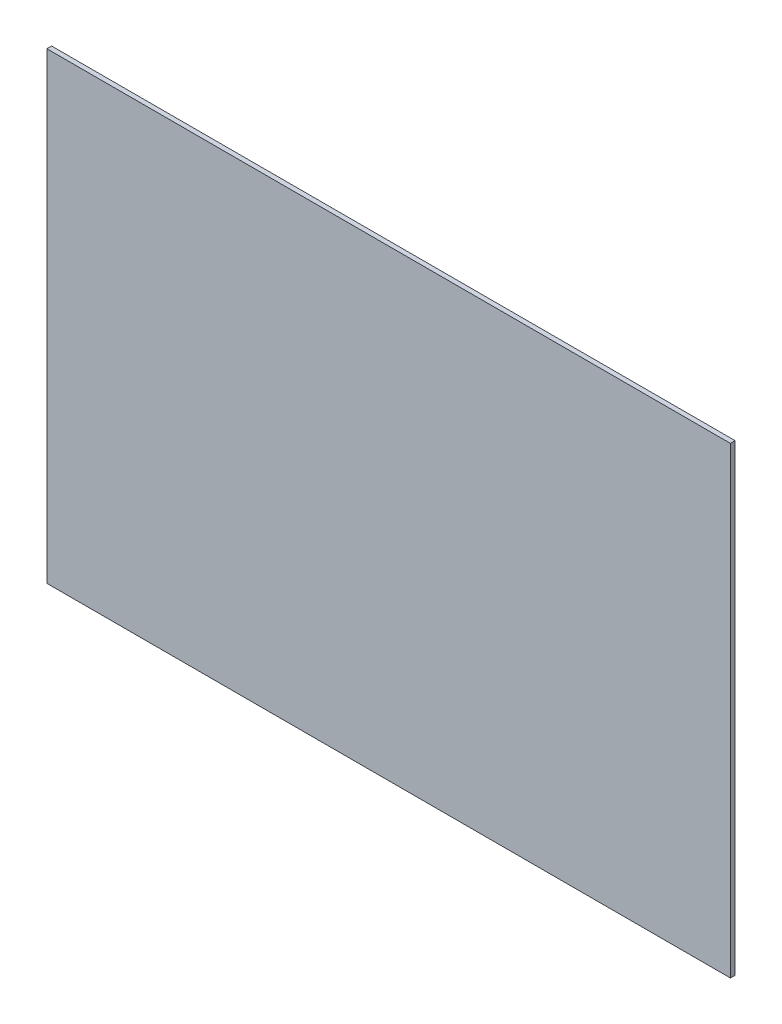
ISO-10303-21;
HEADER;
FILE_DESCRIPTION(('STEP AP214'),'2;1');
FILE_NAME('part.step','',(''),(''),'','','');
FILE_SCHEMA(('AUTOMOTIVE_DESIGN { 1 0 10303 214 1 1 1 1 }'));
ENDSEC;
DATA;
#1=APPLICATION_CONTEXT('core data for automotive mechanical design processes');
#2=APPLICATION_PROTOCOL_DEFINITION('international standard','automotive_design',2000,#1);
#3=PRODUCT_CONTEXT('',#1,'mechanical');
#4=PRODUCT('Part','Part','',(#3));
#5=PRODUCT_RELATED_PRODUCT_CATEGORY('part','',(#4));
#6=PRODUCT_DEFINITION_FORMATION('','',#4);
#7=PRODUCT_DEFINITION_CONTEXT('part definition',#1,'design');
#8=PRODUCT_DEFINITION('design','',#6,#7);
#9=PRODUCT_DEFINITION_SHAPE('','',#8);
#10=(LENGTH_UNIT() NAMED_UNIT(*) SI_UNIT(.MILLI.,.METRE.));
#11=(NAMED_UNIT(*) PLANE_ANGLE_UNIT() SI_UNIT($,.RADIAN.));
#12=(NAMED_UNIT(*) SI_UNIT($,.STERADIAN.) SOLID_ANGLE_UNIT());
#13=UNCERTAINTY_MEASURE_WITH_UNIT(LENGTH_MEASURE(1.E-05),#10,'distance_accuracy_value','');
#14=(GEOMETRIC_REPRESENTATION_CONTEXT(3) GLOBAL_UNCERTAINTY_ASSIGNED_CONTEXT((#13)) GLOBAL_UNIT_ASSIGNED_CONTEXT((#10,
#11,#12)) REPRESENTATION_CONTEXT('',''));
#15=CARTESIAN_POINT('',(0.,0.,0.));
#16=DIRECTION('',(0.,0.,1.));
#17=DIRECTION('',(1.,0.,0.));
#18=AXIS2_PLACEMENT_3D('',#15,#16,#17);
#19=CARTESIAN_POINT('',(229.745,155.63,3.175));
#20=DIRECTION('',(-1.,0.,0.));
#21=DIRECTION('',(0.,-1.,0.));
#22=AXIS2_PLACEMENT_3D('',#19,#20,#21);
#23=PLANE('',#22);
#24=DIRECTION('',(0.,1.,0.));
#25=VECTOR('',#24,1.);
#26=CARTESIAN_POINT('',(229.745,155.63,0.));
#27=LINE('',#26,#25);
#28=CARTESIAN_POINT('',(229.745,-155.63,0.));
#29=VERTEX_POINT('',#28);
#30=CARTESIAN_POINT('',(229.745,155.63,0.));
#31=VERTEX_POINT('',#30);
#32=EDGE_CURVE('E104',#29,#31,#27,.T.);
#33=ORIENTED_EDGE('',*,*,#32,.T.);
#34=DIRECTION('',(0.,0.,-1.));
#35=VECTOR('',#34,1.);
#36=CARTESIAN_POINT('',(229.745,155.63,3.175));
#37=LINE('',#36,#35);
#38=CARTESIAN_POINT('',(229.745,155.63,3.175));
#39=VERTEX_POINT('',#38);
#40=EDGE_CURVE('E11',#39,#31,#37,.T.);
#41=ORIENTED_EDGE('',*,*,#40,.F.);
#42=DIRECTION('',(0.,1.,0.));
#43=VECTOR('',#42,1.);
#44=CARTESIAN_POINT('',(229.745,155.63,3.175));
#45=LINE('',#44,#43);
#46=CARTESIAN_POINT('',(229.745,-155.63,3.175));
#47=VERTEX_POINT('',#46);
#48=EDGE_CURVE('E92',#47,#39,#45,.T.);
#49=ORIENTED_EDGE('',*,*,#48,.F.);
#50=DIRECTION('',(0.,0.,-1.));
#51=VECTOR('',#50,1.);
#52=CARTESIAN_POINT('',(229.745,-155.63,3.175));
#53=LINE('',#52,#51);
#54=EDGE_CURVE('E100',#47,#29,#53,.T.);
#55=ORIENTED_EDGE('',*,*,#54,.T.);
#56=EDGE_LOOP('',(#33,#41,#49,#55));
#57=FACE_BOUND('',#56,.T.);
#58=ADVANCED_FACE('F41',(#57),#23,.F.);
#59=CARTESIAN_POINT('',(-229.745,155.63,3.175));
#60=DIRECTION('',(0.,-1.,0.));
#61=DIRECTION('',(0.,0.,-1.));
#62=AXIS2_PLACEMENT_3D('',#59,#60,#61);
#63=PLANE('',#62);
#64=DIRECTION('',(-1.,0.,0.));
#65=VECTOR('',#64,1.);
#66=CARTESIAN_POINT('',(-229.745,155.63,0.));
#67=LINE('',#66,#65);
#68=CARTESIAN_POINT('',(-229.745,155.63,0.));
#69=VERTEX_POINT('',#68);
#70=EDGE_CURVE('E96',#31,#69,#67,.T.);
#71=ORIENTED_EDGE('',*,*,#70,.T.);
#72=DIRECTION('',(0.,0.,-1.));
#73=VECTOR('',#72,1.);
#74=CARTESIAN_POINT('',(-229.745,155.63,3.175));
#75=LINE('',#74,#73);
#76=CARTESIAN_POINT('',(-229.745,155.63,3.175));
#77=VERTEX_POINT('',#76);
#78=EDGE_CURVE('E49',#77,#69,#75,.T.);
#79=ORIENTED_EDGE('',*,*,#78,.F.);
#80=DIRECTION('',(-1.,0.,0.));
#81=VECTOR('',#80,1.);
#82=CARTESIAN_POINT('',(-229.745,155.63,3.175));
#83=LINE('',#82,#81);
#84=EDGE_CURVE('E87',#39,#77,#83,.T.);
#85=ORIENTED_EDGE('',*,*,#84,.F.);
#86=ORIENTED_EDGE('',*,*,#40,.T.);
#87=EDGE_LOOP('',(#71,#79,#85,#86));
#88=FACE_BOUND('',#87,.T.);
#89=ADVANCED_FACE('F95',(#88),#63,.F.);
#90=CARTESIAN_POINT('',(-229.745,155.63,3.175));
#91=DIRECTION('',(1.,0.,0.));
#92=DIRECTION('',(0.,1.,0.));
#93=AXIS2_PLACEMENT_3D('',#90,#91,#92);
#94=PLANE('',#93);
#95=DIRECTION('',(0.,-1.,0.));
#96=VECTOR('',#95,1.);
#97=CARTESIAN_POINT('',(-229.745,155.63,0.));
#98=LINE('',#97,#96);
#99=CARTESIAN_POINT('',(-229.745,-155.63,0.));
#100=VERTEX_POINT('',#99);
#101=EDGE_CURVE('E74',#69,#100,#98,.T.);
#102=ORIENTED_EDGE('',*,*,#101,.T.);
#103=DIRECTION('',(0.,0.,-1.));
#104=VECTOR('',#103,1.);
#105=CARTESIAN_POINT('',(-229.745,-155.63,3.175));
#106=LINE('',#105,#104);
#107=CARTESIAN_POINT('',(-229.745,-155.63,3.175));
#108=VERTEX_POINT('',#107);
#109=EDGE_CURVE('E97',#108,#100,#106,.T.);
#110=ORIENTED_EDGE('',*,*,#109,.F.);
#111=DIRECTION('',(0.,-1.,0.));
#112=VECTOR('',#111,1.);
#113=CARTESIAN_POINT('',(-229.745,155.63,3.175));
#114=LINE('',#113,#112);
#115=EDGE_CURVE('E90',#77,#108,#114,.T.);
#116=ORIENTED_EDGE('',*,*,#115,.F.);
#117=ORIENTED_EDGE('',*,*,#78,.T.);
#118=EDGE_LOOP('',(#102,#110,#116,#117));
#119=FACE_BOUND('',#118,.T.);
#120=ADVANCED_FACE('F98',(#119),#94,.F.);
#121=CARTESIAN_POINT('',(-229.745,-155.63,3.175));
#122=DIRECTION('',(0.,1.,0.));
#123=DIRECTION('',(0.,0.,1.));
#124=AXIS2_PLACEMENT_3D('',#121,#122,#123);
#125=PLANE('',#124);
#126=DIRECTION('',(1.,0.,0.));
#127=VECTOR('',#126,1.);
#128=CARTESIAN_POINT('',(-229.745,-155.63,0.));
#129=LINE('',#128,#127);
#130=EDGE_CURVE('E80',#100,#29,#129,.T.);
#131=ORIENTED_EDGE('',*,*,#130,.T.);
#132=ORIENTED_EDGE('',*,*,#54,.F.);
#133=DIRECTION('',(1.,0.,0.));
#134=VECTOR('',#133,1.);
#135=CARTESIAN_POINT('',(-229.745,-155.63,3.175));
#136=LINE('',#135,#134);
#137=EDGE_CURVE('E57',#108,#47,#136,.T.);
#138=ORIENTED_EDGE('',*,*,#137,.F.);
#139=ORIENTED_EDGE('',*,*,#109,.T.);
#140=EDGE_LOOP('',(#131,#132,#138,#139));
#141=FACE_BOUND('',#140,.T.);
#142=ADVANCED_FACE('F111',(#141),#125,.F.);
#143=CARTESIAN_POINT('',(0.,0.,3.175));
#144=DIRECTION('',(0.,0.,1.));
#145=DIRECTION('',(1.,0.,0.));
#146=AXIS2_PLACEMENT_3D('',#143,#144,#145);
#147=PLANE('',#146);
#148=ORIENTED_EDGE('',*,*,#48,.T.);
#149=ORIENTED_EDGE('',*,*,#84,.T.);
#150=ORIENTED_EDGE('',*,*,#115,.T.);
#151=ORIENTED_EDGE('',*,*,#137,.T.);
#152=EDGE_LOOP('',(#148,#149,#150,#151));
#153=FACE_BOUND('',#152,.T.);
#154=ADVANCED_FACE('F88',(#153),#147,.T.);
#155=CARTESIAN_POINT('',(0.,0.,0.));
#156=DIRECTION('',(0.,0.,1.));
#157=DIRECTION('',(1.,0.,0.));
#158=AXIS2_PLACEMENT_3D('',#155,#156,#157);
#159=PLANE('',#158);
#160=ORIENTED_EDGE('',*,*,#32,.F.);
#161=ORIENTED_EDGE('',*,*,#130,.F.);
#162=ORIENTED_EDGE('',*,*,#101,.F.);
#163=ORIENTED_EDGE('',*,*,#70,.F.);
#164=EDGE_LOOP('',(#160,#161,#162,#163));
#165=FACE_BOUND('',#164,.T.);
#166=ADVANCED_FACE('F114',(#165),#159,.F.);
#167=CLOSED_SHELL('',(#58,#89,#120,#142,#154,#166));
#168=MANIFOLD_SOLID_BREP('B2',#167);
#169=ADVANCED_BREP_SHAPE_REPRESENTATION('',(#18,#168),#14);
#170=SHAPE_DEFINITION_REPRESENTATION(#9,#169);
ENDSEC;
END-ISO-10303-21;
